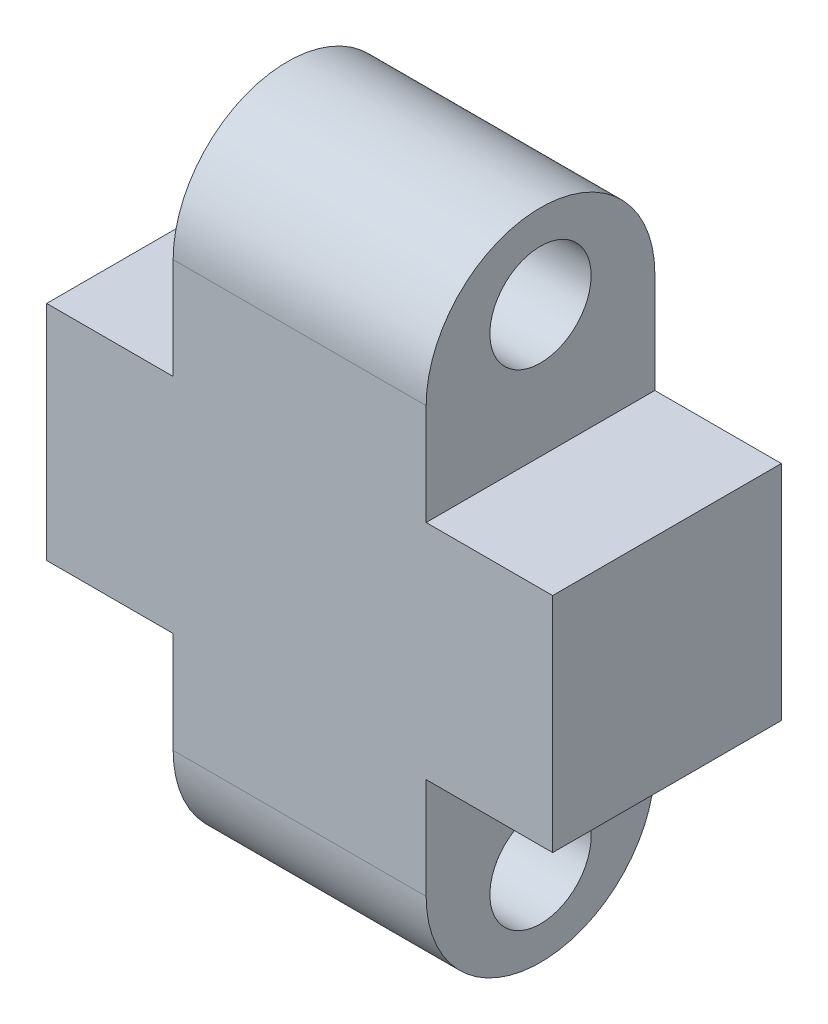
ISO-10303-21;
HEADER;
FILE_DESCRIPTION(('STEP AP214'),'2;1');
FILE_NAME('part.step','',(''),(''),'','','');
FILE_SCHEMA(('AUTOMOTIVE_DESIGN { 1 0 10303 214 1 1 1 1 }'));
ENDSEC;
DATA;
#1=APPLICATION_CONTEXT('core data for automotive mechanical design processes');
#2=APPLICATION_PROTOCOL_DEFINITION('international standard','automotive_design',2000,#1);
#3=PRODUCT_CONTEXT('',#1,'mechanical');
#4=PRODUCT('Part','Part','',(#3));
#5=PRODUCT_RELATED_PRODUCT_CATEGORY('part','',(#4));
#6=PRODUCT_DEFINITION_FORMATION('','',#4);
#7=PRODUCT_DEFINITION_CONTEXT('part definition',#1,'design');
#8=PRODUCT_DEFINITION('design','',#6,#7);
#9=PRODUCT_DEFINITION_SHAPE('','',#8);
#10=(LENGTH_UNIT() NAMED_UNIT(*) SI_UNIT(.MILLI.,.METRE.));
#11=(NAMED_UNIT(*) PLANE_ANGLE_UNIT() SI_UNIT($,.RADIAN.));
#12=(NAMED_UNIT(*) SI_UNIT($,.STERADIAN.) SOLID_ANGLE_UNIT());
#13=UNCERTAINTY_MEASURE_WITH_UNIT(LENGTH_MEASURE(1.E-05),#10,'distance_accuracy_value','');
#14=(GEOMETRIC_REPRESENTATION_CONTEXT(3) GLOBAL_UNCERTAINTY_ASSIGNED_CONTEXT((#13)) GLOBAL_UNIT_ASSIGNED_CONTEXT((#10,
#11,#12)) REPRESENTATION_CONTEXT('',''));
#15=CARTESIAN_POINT('',(0.,0.,0.));
#16=DIRECTION('',(0.,0.,1.));
#17=DIRECTION('',(1.,0.,0.));
#18=AXIS2_PLACEMENT_3D('',#15,#16,#17);
#19=CARTESIAN_POINT('',(-25.,-11.,22.6));
#20=DIRECTION('',(0.,1.,0.));
#21=DIRECTION('',(0.,0.,1.));
#22=AXIS2_PLACEMENT_3D('',#19,#20,#21);
#23=PLANE('',#22);
#24=DIRECTION('',(0.,0.,-1.));
#25=VECTOR('',#24,1.);
#26=CARTESIAN_POINT('',(-12.5,-11.,0.));
#27=LINE('',#26,#25);
#28=CARTESIAN_POINT('',(-12.5,-11.,22.6));
#29=VERTEX_POINT('',#28);
#30=CARTESIAN_POINT('',(-12.5,-11.,0.));
#31=VERTEX_POINT('',#30);
#32=EDGE_CURVE('E211',#29,#31,#27,.T.);
#33=ORIENTED_EDGE('',*,*,#32,.F.);
#34=DIRECTION('',(1.,0.,0.));
#35=VECTOR('',#34,1.);
#36=CARTESIAN_POINT('',(-25.,-11.,22.6));
#37=LINE('',#36,#35);
#38=CARTESIAN_POINT('',(-25.,-11.,22.6));
#39=VERTEX_POINT('',#38);
#40=EDGE_CURVE('E160',#39,#29,#37,.T.);
#41=ORIENTED_EDGE('',*,*,#40,.F.);
#42=DIRECTION('',(0.,0.,-1.));
#43=VECTOR('',#42,1.);
#44=CARTESIAN_POINT('',(-25.,-11.,22.6));
#45=LINE('',#44,#43);
#46=CARTESIAN_POINT('',(-25.,-11.,0.));
#47=VERTEX_POINT('',#46);
#48=EDGE_CURVE('E190',#39,#47,#45,.T.);
#49=ORIENTED_EDGE('',*,*,#48,.T.);
#50=DIRECTION('',(1.,0.,0.));
#51=VECTOR('',#50,1.);
#52=CARTESIAN_POINT('',(-25.,-11.,0.));
#53=LINE('',#52,#51);
#54=EDGE_CURVE('E183',#47,#31,#53,.T.);
#55=ORIENTED_EDGE('',*,*,#54,.T.);
#56=EDGE_LOOP('',(#33,#41,#49,#55));
#57=FACE_BOUND('',#56,.T.);
#58=ADVANCED_FACE('F45',(#57),#23,.F.);
#59=CARTESIAN_POINT('',(-25.,11.,22.6));
#60=DIRECTION('',(0.,-1.,0.));
#61=DIRECTION('',(0.,0.,-1.));
#62=AXIS2_PLACEMENT_3D('',#59,#60,#61);
#63=PLANE('',#62);
#64=DIRECTION('',(0.,0.,-1.));
#65=VECTOR('',#64,1.);
#66=CARTESIAN_POINT('',(12.5,11.,0.));
#67=LINE('',#66,#65);
#68=CARTESIAN_POINT('',(12.5,11.,22.6));
#69=VERTEX_POINT('',#68);
#70=CARTESIAN_POINT('',(12.5,11.,0.));
#71=VERTEX_POINT('',#70);
#72=EDGE_CURVE('E233',#69,#71,#67,.T.);
#73=ORIENTED_EDGE('',*,*,#72,.F.);
#74=DIRECTION('',(-1.,0.,0.));
#75=VECTOR('',#74,1.);
#76=CARTESIAN_POINT('',(-25.,11.,22.6));
#77=LINE('',#76,#75);
#78=CARTESIAN_POINT('',(25.,11.,22.6));
#79=VERTEX_POINT('',#78);
#80=EDGE_CURVE('E166',#79,#69,#77,.T.);
#81=ORIENTED_EDGE('',*,*,#80,.F.);
#82=DIRECTION('',(0.,0.,-1.));
#83=VECTOR('',#82,1.);
#84=CARTESIAN_POINT('',(25.,11.,22.6));
#85=LINE('',#84,#83);
#86=CARTESIAN_POINT('',(25.,11.,0.));
#87=VERTEX_POINT('',#86);
#88=EDGE_CURVE('E11',#79,#87,#85,.T.);
#89=ORIENTED_EDGE('',*,*,#88,.T.);
#90=DIRECTION('',(-1.,0.,0.));
#91=VECTOR('',#90,1.);
#92=CARTESIAN_POINT('',(-25.,11.,0.));
#93=LINE('',#92,#91);
#94=EDGE_CURVE('E176',#87,#71,#93,.T.);
#95=ORIENTED_EDGE('',*,*,#94,.T.);
#96=EDGE_LOOP('',(#73,#81,#89,#95));
#97=FACE_BOUND('',#96,.T.);
#98=ADVANCED_FACE('F323',(#97),#63,.F.);
#99=CARTESIAN_POINT('',(25.,11.,22.6));
#100=DIRECTION('',(-1.,0.,0.));
#101=DIRECTION('',(0.,0.,1.));
#102=AXIS2_PLACEMENT_3D('',#99,#100,#101);
#103=PLANE('',#102);
#104=DIRECTION('',(0.,1.,0.));
#105=VECTOR('',#104,1.);
#106=CARTESIAN_POINT('',(25.,11.,0.));
#107=LINE('',#106,#105);
#108=CARTESIAN_POINT('',(25.,-11.,0.));
#109=VERTEX_POINT('',#108);
#110=EDGE_CURVE('E170',#109,#87,#107,.T.);
#111=ORIENTED_EDGE('',*,*,#110,.T.);
#112=ORIENTED_EDGE('',*,*,#88,.F.);
#113=DIRECTION('',(0.,1.,0.));
#114=VECTOR('',#113,1.);
#115=CARTESIAN_POINT('',(25.,11.,22.6));
#116=LINE('',#115,#114);
#117=CARTESIAN_POINT('',(25.,-11.,22.6));
#118=VERTEX_POINT('',#117);
#119=EDGE_CURVE('E187',#118,#79,#116,.T.);
#120=ORIENTED_EDGE('',*,*,#119,.F.);
#121=DIRECTION('',(0.,0.,-1.));
#122=VECTOR('',#121,1.);
#123=CARTESIAN_POINT('',(25.,-11.,22.6));
#124=LINE('',#123,#122);
#125=EDGE_CURVE('E157',#118,#109,#124,.T.);
#126=ORIENTED_EDGE('',*,*,#125,.T.);
#127=EDGE_LOOP('',(#111,#112,#120,#126));
#128=FACE_BOUND('',#127,.T.);
#129=ADVANCED_FACE('F47',(#128),#103,.F.);
#130=CARTESIAN_POINT('',(-12.5,11.,22.6));
#131=VERTEX_POINT('',#130);
#132=CARTESIAN_POINT('',(-25.,11.,22.6));
#133=VERTEX_POINT('',#132);
#134=EDGE_CURVE('E69',#131,#133,#77,.T.);
#135=ORIENTED_EDGE('',*,*,#134,.F.);
#136=DIRECTION('',(0.,0.,-1.));
#137=VECTOR('',#136,1.);
#138=CARTESIAN_POINT('',(-12.5,11.,0.));
#139=LINE('',#138,#137);
#140=CARTESIAN_POINT('',(-12.5,11.,0.));
#141=VERTEX_POINT('',#140);
#142=EDGE_CURVE('E240',#131,#141,#139,.T.);
#143=ORIENTED_EDGE('',*,*,#142,.T.);
#144=CARTESIAN_POINT('',(-25.,11.,0.));
#145=VERTEX_POINT('',#144);
#146=EDGE_CURVE('E174',#141,#145,#93,.T.);
#147=ORIENTED_EDGE('',*,*,#146,.T.);
#148=DIRECTION('',(0.,0.,-1.));
#149=VECTOR('',#148,1.);
#150=CARTESIAN_POINT('',(-25.,11.,22.6));
#151=LINE('',#150,#149);
#152=EDGE_CURVE('E54',#133,#145,#151,.T.);
#153=ORIENTED_EDGE('',*,*,#152,.F.);
#154=EDGE_LOOP('',(#135,#143,#147,#153));
#155=FACE_BOUND('',#154,.T.);
#156=ADVANCED_FACE('F306',(#155),#63,.F.);
#157=CARTESIAN_POINT('',(-25.,11.,22.6));
#158=DIRECTION('',(1.,0.,0.));
#159=DIRECTION('',(0.,0.,-1.));
#160=AXIS2_PLACEMENT_3D('',#157,#158,#159);
#161=PLANE('',#160);
#162=DIRECTION('',(0.,-1.,0.));
#163=VECTOR('',#162,1.);
#164=CARTESIAN_POINT('',(-25.,11.,0.));
#165=LINE('',#164,#163);
#166=EDGE_CURVE('E179',#145,#47,#165,.T.);
#167=ORIENTED_EDGE('',*,*,#166,.T.);
#168=ORIENTED_EDGE('',*,*,#48,.F.);
#169=DIRECTION('',(0.,-1.,0.));
#170=VECTOR('',#169,1.);
#171=CARTESIAN_POINT('',(-25.,11.,22.6));
#172=LINE('',#171,#170);
#173=EDGE_CURVE('E161',#133,#39,#172,.T.);
#174=ORIENTED_EDGE('',*,*,#173,.F.);
#175=ORIENTED_EDGE('',*,*,#152,.T.);
#176=EDGE_LOOP('',(#167,#168,#174,#175));
#177=FACE_BOUND('',#176,.T.);
#178=ADVANCED_FACE('F198',(#177),#161,.F.);
#179=CARTESIAN_POINT('',(12.5,-11.,22.6));
#180=VERTEX_POINT('',#179);
#181=EDGE_CURVE('E148',#180,#118,#37,.T.);
#182=ORIENTED_EDGE('',*,*,#181,.F.);
#183=DIRECTION('',(0.,0.,-1.));
#184=VECTOR('',#183,1.);
#185=CARTESIAN_POINT('',(12.5,-11.,0.));
#186=LINE('',#185,#184);
#187=CARTESIAN_POINT('',(12.5,-11.,0.));
#188=VERTEX_POINT('',#187);
#189=EDGE_CURVE('E134',#180,#188,#186,.T.);
#190=ORIENTED_EDGE('',*,*,#189,.T.);
#191=EDGE_CURVE('E182',#188,#109,#53,.T.);
#192=ORIENTED_EDGE('',*,*,#191,.T.);
#193=ORIENTED_EDGE('',*,*,#125,.F.);
#194=EDGE_LOOP('',(#182,#190,#192,#193));
#195=FACE_BOUND('',#194,.T.);
#196=ADVANCED_FACE('F155',(#195),#23,.F.);
#197=CARTESIAN_POINT('',(0.,0.,22.6));
#198=DIRECTION('',(0.,0.,1.));
#199=DIRECTION('',(1.,0.,0.));
#200=AXIS2_PLACEMENT_3D('',#197,#198,#199);
#201=PLANE('',#200);
#202=ORIENTED_EDGE('',*,*,#119,.T.);
#203=ORIENTED_EDGE('',*,*,#80,.T.);
#204=DIRECTION('',(0.,-1.,0.));
#205=VECTOR('',#204,1.);
#206=CARTESIAN_POINT('',(12.5,11.,22.6));
#207=LINE('',#206,#205);
#208=CARTESIAN_POINT('',(12.5,21.,22.6));
#209=VERTEX_POINT('',#208);
#210=EDGE_CURVE('E230',#209,#69,#207,.T.);
#211=ORIENTED_EDGE('',*,*,#210,.F.);
#212=DIRECTION('',(-1.,0.,0.));
#213=VECTOR('',#212,1.);
#214=CARTESIAN_POINT('',(12.5,21.,22.6));
#215=LINE('',#214,#213);
#216=CARTESIAN_POINT('',(-12.5,21.,22.6));
#217=VERTEX_POINT('',#216);
#218=EDGE_CURVE('E227',#209,#217,#215,.T.);
#219=ORIENTED_EDGE('',*,*,#218,.T.);
#220=DIRECTION('',(0.,-1.,0.));
#221=VECTOR('',#220,1.);
#222=CARTESIAN_POINT('',(-12.5,11.,22.6));
#223=LINE('',#222,#221);
#224=EDGE_CURVE('E216',#217,#131,#223,.T.);
#225=ORIENTED_EDGE('',*,*,#224,.T.);
#226=ORIENTED_EDGE('',*,*,#134,.T.);
#227=ORIENTED_EDGE('',*,*,#173,.T.);
#228=ORIENTED_EDGE('',*,*,#40,.T.);
#229=DIRECTION('',(0.,1.,0.));
#230=VECTOR('',#229,1.);
#231=CARTESIAN_POINT('',(-12.5,-11.,22.6));
#232=LINE('',#231,#230);
#233=CARTESIAN_POINT('',(-12.5,-21.,22.6));
#234=VERTEX_POINT('',#233);
#235=EDGE_CURVE('E212',#234,#29,#232,.T.);
#236=ORIENTED_EDGE('',*,*,#235,.F.);
#237=DIRECTION('',(-1.,0.,0.));
#238=VECTOR('',#237,1.);
#239=CARTESIAN_POINT('',(12.5,-21.,22.6));
#240=LINE('',#239,#238);
#241=CARTESIAN_POINT('',(12.5,-21.,22.6));
#242=VERTEX_POINT('',#241);
#243=EDGE_CURVE('E151',#242,#234,#240,.T.);
#244=ORIENTED_EDGE('',*,*,#243,.F.);
#245=DIRECTION('',(0.,1.,0.));
#246=VECTOR('',#245,1.);
#247=CARTESIAN_POINT('',(12.5,-11.,22.6));
#248=LINE('',#247,#246);
#249=EDGE_CURVE('E137',#242,#180,#248,.T.);
#250=ORIENTED_EDGE('',*,*,#249,.T.);
#251=ORIENTED_EDGE('',*,*,#181,.T.);
#252=EDGE_LOOP('',(#202,#203,#211,#219,#225,#226,#227,#228,#236,#244,#250,#251));
#253=FACE_BOUND('',#252,.T.);
#254=ADVANCED_FACE('F147',(#253),#201,.T.);
#255=CARTESIAN_POINT('',(0.,0.,0.));
#256=DIRECTION('',(0.,0.,1.));
#257=DIRECTION('',(1.,0.,0.));
#258=AXIS2_PLACEMENT_3D('',#255,#256,#257);
#259=PLANE('',#258);
#260=ORIENTED_EDGE('',*,*,#110,.F.);
#261=ORIENTED_EDGE('',*,*,#191,.F.);
#262=DIRECTION('',(0.,-1.,0.));
#263=VECTOR('',#262,1.);
#264=CARTESIAN_POINT('',(12.5,-21.,0.));
#265=LINE('',#264,#263);
#266=CARTESIAN_POINT('',(12.5,-21.,0.));
#267=VERTEX_POINT('',#266);
#268=EDGE_CURVE('E61',#188,#267,#265,.T.);
#269=ORIENTED_EDGE('',*,*,#268,.T.);
#270=DIRECTION('',(-1.,0.,0.));
#271=VECTOR('',#270,1.);
#272=CARTESIAN_POINT('',(12.5,-21.,0.));
#273=LINE('',#272,#271);
#274=CARTESIAN_POINT('',(-12.5,-21.,0.));
#275=VERTEX_POINT('',#274);
#276=EDGE_CURVE('E265',#267,#275,#273,.T.);
#277=ORIENTED_EDGE('',*,*,#276,.T.);
#278=DIRECTION('',(0.,-1.,0.));
#279=VECTOR('',#278,1.);
#280=CARTESIAN_POINT('',(-12.5,-21.,0.));
#281=LINE('',#280,#279);
#282=EDGE_CURVE('E143',#31,#275,#281,.T.);
#283=ORIENTED_EDGE('',*,*,#282,.F.);
#284=ORIENTED_EDGE('',*,*,#54,.F.);
#285=ORIENTED_EDGE('',*,*,#166,.F.);
#286=ORIENTED_EDGE('',*,*,#146,.F.);
#287=DIRECTION('',(0.,1.,0.));
#288=VECTOR('',#287,1.);
#289=CARTESIAN_POINT('',(-12.5,21.,0.));
#290=LINE('',#289,#288);
#291=CARTESIAN_POINT('',(-12.5,21.,0.));
#292=VERTEX_POINT('',#291);
#293=EDGE_CURVE('E237',#141,#292,#290,.T.);
#294=ORIENTED_EDGE('',*,*,#293,.T.);
#295=DIRECTION('',(-1.,0.,0.));
#296=VECTOR('',#295,1.);
#297=CARTESIAN_POINT('',(12.5,21.,0.));
#298=LINE('',#297,#296);
#299=CARTESIAN_POINT('',(12.5,21.,0.));
#300=VERTEX_POINT('',#299);
#301=EDGE_CURVE('E175',#300,#292,#298,.T.);
#302=ORIENTED_EDGE('',*,*,#301,.F.);
#303=DIRECTION('',(0.,1.,0.));
#304=VECTOR('',#303,1.);
#305=CARTESIAN_POINT('',(12.5,21.,0.));
#306=LINE('',#305,#304);
#307=EDGE_CURVE('E250',#71,#300,#306,.T.);
#308=ORIENTED_EDGE('',*,*,#307,.F.);
#309=ORIENTED_EDGE('',*,*,#94,.F.);
#310=EDGE_LOOP('',(#260,#261,#269,#277,#283,#284,#285,#286,#294,#302,#308,#309));
#311=FACE_BOUND('',#310,.T.);
#312=ADVANCED_FACE('F204',(#311),#259,.F.);
#313=CARTESIAN_POINT('',(12.5,21.,11.3));
#314=DIRECTION('',(-1.,0.,0.));
#315=DIRECTION('',(0.,0.,1.));
#316=AXIS2_PLACEMENT_3D('',#313,#314,#315);
#317=PLANE('',#316);
#318=ORIENTED_EDGE('',*,*,#72,.T.);
#319=ORIENTED_EDGE('',*,*,#307,.T.);
#320=CARTESIAN_POINT('',(12.5,21.,11.3));
#321=DIRECTION('',(1.,0.,0.));
#322=DIRECTION('',(0.,0.,1.));
#323=AXIS2_PLACEMENT_3D('',#320,#321,#322);
#324=CIRCLE('',#323,11.3);
#325=EDGE_CURVE('E247',#300,#209,#324,.T.);
#326=ORIENTED_EDGE('',*,*,#325,.T.);
#327=ORIENTED_EDGE('',*,*,#210,.T.);
#328=EDGE_LOOP('',(#318,#319,#326,#327));
#329=FACE_BOUND('',#328,.T.);
#330=CARTESIAN_POINT('',(12.5,24.,11.3));
#331=DIRECTION('',(1.,0.,0.));
#332=DIRECTION('',(0.,0.,-1.));
#333=AXIS2_PLACEMENT_3D('',#330,#331,#332);
#334=CIRCLE('',#333,5.);
#335=CARTESIAN_POINT('',(12.5,24.,6.3));
#336=VERTEX_POINT('',#335);
#337=EDGE_CURVE('E243',#336,#336,#334,.T.);
#338=ORIENTED_EDGE('',*,*,#337,.F.);
#339=EDGE_LOOP('',(#338));
#340=FACE_BOUND('',#339,.T.);
#341=ADVANCED_FACE('F319',(#329,#340),#317,.F.);
#342=CARTESIAN_POINT('',(-12.5,21.,11.3));
#343=DIRECTION('',(-1.,0.,0.));
#344=DIRECTION('',(0.,0.,1.));
#345=AXIS2_PLACEMENT_3D('',#342,#343,#344);
#346=PLANE('',#345);
#347=ORIENTED_EDGE('',*,*,#142,.F.);
#348=ORIENTED_EDGE('',*,*,#224,.F.);
#349=CARTESIAN_POINT('',(-12.5,21.,11.3));
#350=DIRECTION('',(1.,0.,0.));
#351=DIRECTION('',(0.,0.,1.));
#352=AXIS2_PLACEMENT_3D('',#349,#350,#351);
#353=CIRCLE('',#352,11.3);
#354=EDGE_CURVE('E234',#292,#217,#353,.T.);
#355=ORIENTED_EDGE('',*,*,#354,.F.);
#356=ORIENTED_EDGE('',*,*,#293,.F.);
#357=EDGE_LOOP('',(#347,#348,#355,#356));
#358=FACE_BOUND('',#357,.T.);
#359=CARTESIAN_POINT('',(-12.5,24.,11.3));
#360=DIRECTION('',(1.,0.,0.));
#361=DIRECTION('',(0.,0.,-1.));
#362=AXIS2_PLACEMENT_3D('',#359,#360,#361);
#363=CIRCLE('',#362,5.);
#364=CARTESIAN_POINT('',(-12.5,24.,6.3));
#365=VERTEX_POINT('',#364);
#366=EDGE_CURVE('E256',#365,#365,#363,.T.);
#367=ORIENTED_EDGE('',*,*,#366,.T.);
#368=EDGE_LOOP('',(#367));
#369=FACE_BOUND('',#368,.T.);
#370=ADVANCED_FACE('F308',(#358,#369),#346,.T.);
#371=CARTESIAN_POINT('',(12.5,21.,11.3));
#372=DIRECTION('',(-1.,0.,0.));
#373=DIRECTION('',(0.,0.,1.));
#374=AXIS2_PLACEMENT_3D('',#371,#372,#373);
#375=CYLINDRICAL_SURFACE('',#374,11.3);
#376=ORIENTED_EDGE('',*,*,#354,.T.);
#377=ORIENTED_EDGE('',*,*,#218,.F.);
#378=ORIENTED_EDGE('',*,*,#325,.F.);
#379=ORIENTED_EDGE('',*,*,#301,.T.);
#380=EDGE_LOOP('',(#376,#377,#378,#379));
#381=FACE_BOUND('',#380,.T.);
#382=ADVANCED_FACE('F315',(#381),#375,.T.);
#383=CARTESIAN_POINT('',(12.5,24.,11.3));
#384=DIRECTION('',(-1.,0.,0.));
#385=DIRECTION('',(0.,0.,1.));
#386=AXIS2_PLACEMENT_3D('',#383,#384,#385);
#387=CYLINDRICAL_SURFACE('',#386,5.);
#388=ORIENTED_EDGE('',*,*,#337,.T.);
#389=EDGE_LOOP('',(#388));
#390=FACE_BOUND('',#389,.T.);
#391=ORIENTED_EDGE('',*,*,#366,.F.);
#392=EDGE_LOOP('',(#391));
#393=FACE_BOUND('',#392,.T.);
#394=ADVANCED_FACE('F376',(#390,#393),#387,.F.);
#395=CARTESIAN_POINT('',(12.5,-21.,11.3));
#396=DIRECTION('',(-1.,0.,0.));
#397=DIRECTION('',(0.,0.,1.));
#398=AXIS2_PLACEMENT_3D('',#395,#396,#397);
#399=CYLINDRICAL_SURFACE('',#398,11.3);
#400=CARTESIAN_POINT('',(-12.5,-21.,11.3));
#401=DIRECTION('',(-1.,0.,0.));
#402=DIRECTION('',(0.,0.,1.));
#403=AXIS2_PLACEMENT_3D('',#400,#401,#402);
#404=CIRCLE('',#403,11.3);
#405=EDGE_CURVE('E270',#275,#234,#404,.T.);
#406=ORIENTED_EDGE('',*,*,#405,.F.);
#407=ORIENTED_EDGE('',*,*,#276,.F.);
#408=CARTESIAN_POINT('',(12.5,-21.,11.3));
#409=DIRECTION('',(-1.,0.,0.));
#410=DIRECTION('',(0.,0.,1.));
#411=AXIS2_PLACEMENT_3D('',#408,#409,#410);
#412=CIRCLE('',#411,11.3);
#413=EDGE_CURVE('E153',#267,#242,#412,.T.);
#414=ORIENTED_EDGE('',*,*,#413,.T.);
#415=ORIENTED_EDGE('',*,*,#243,.T.);
#416=EDGE_LOOP('',(#406,#407,#414,#415));
#417=FACE_BOUND('',#416,.T.);
#418=ADVANCED_FACE('F303',(#417),#399,.T.);
#419=CARTESIAN_POINT('',(12.5,-21.,11.3));
#420=DIRECTION('',(-1.,0.,0.));
#421=DIRECTION('',(0.,0.,1.));
#422=AXIS2_PLACEMENT_3D('',#419,#420,#421);
#423=PLANE('',#422);
#424=CARTESIAN_POINT('',(12.5,-24.,11.3));
#425=DIRECTION('',(-1.,0.,0.));
#426=DIRECTION('',(0.,0.,-1.));
#427=AXIS2_PLACEMENT_3D('',#424,#425,#426);
#428=CIRCLE('',#427,5.);
#429=CARTESIAN_POINT('',(12.5,-24.,6.3));
#430=VERTEX_POINT('',#429);
#431=EDGE_CURVE('E277',#430,#430,#428,.T.);
#432=ORIENTED_EDGE('',*,*,#431,.T.);
#433=EDGE_LOOP('',(#432));
#434=FACE_BOUND('',#433,.T.);
#435=ORIENTED_EDGE('',*,*,#189,.F.);
#436=ORIENTED_EDGE('',*,*,#249,.F.);
#437=ORIENTED_EDGE('',*,*,#413,.F.);
#438=ORIENTED_EDGE('',*,*,#268,.F.);
#439=EDGE_LOOP('',(#435,#436,#437,#438));
#440=FACE_BOUND('',#439,.T.);
#441=ADVANCED_FACE('F136',(#434,#440),#423,.F.);
#442=CARTESIAN_POINT('',(-12.5,-21.,11.3));
#443=DIRECTION('',(-1.,0.,0.));
#444=DIRECTION('',(0.,0.,1.));
#445=AXIS2_PLACEMENT_3D('',#442,#443,#444);
#446=PLANE('',#445);
#447=CARTESIAN_POINT('',(-12.5,-24.,11.3));
#448=DIRECTION('',(-1.,0.,0.));
#449=DIRECTION('',(0.,0.,-1.));
#450=AXIS2_PLACEMENT_3D('',#447,#448,#449);
#451=CIRCLE('',#450,5.);
#452=CARTESIAN_POINT('',(-12.5,-24.,6.3));
#453=VERTEX_POINT('',#452);
#454=EDGE_CURVE('E282',#453,#453,#451,.T.);
#455=ORIENTED_EDGE('',*,*,#454,.F.);
#456=EDGE_LOOP('',(#455));
#457=FACE_BOUND('',#456,.T.);
#458=ORIENTED_EDGE('',*,*,#32,.T.);
#459=ORIENTED_EDGE('',*,*,#282,.T.);
#460=ORIENTED_EDGE('',*,*,#405,.T.);
#461=ORIENTED_EDGE('',*,*,#235,.T.);
#462=EDGE_LOOP('',(#458,#459,#460,#461));
#463=FACE_BOUND('',#462,.T.);
#464=ADVANCED_FACE('F294',(#457,#463),#446,.T.);
#465=CARTESIAN_POINT('',(12.5,-24.,11.3));
#466=DIRECTION('',(-1.,0.,0.));
#467=DIRECTION('',(0.,0.,1.));
#468=AXIS2_PLACEMENT_3D('',#465,#466,#467);
#469=CYLINDRICAL_SURFACE('',#468,5.);
#470=ORIENTED_EDGE('',*,*,#431,.F.);
#471=EDGE_LOOP('',(#470));
#472=FACE_BOUND('',#471,.T.);
#473=ORIENTED_EDGE('',*,*,#454,.T.);
#474=EDGE_LOOP('',(#473));
#475=FACE_BOUND('',#474,.T.);
#476=ADVANCED_FACE('F291',(#472,#475),#469,.F.);
#477=CLOSED_SHELL('',(#58,#98,#129,#156,#178,#196,#254,#312,#341,#370,#382,#394,#418,#441,#464,#476));
#478=MANIFOLD_SOLID_BREP('B2',#477);
#479=ADVANCED_BREP_SHAPE_REPRESENTATION('',(#18,#478),#14);
#480=SHAPE_DEFINITION_REPRESENTATION(#9,#479);
ENDSEC;
END-ISO-10303-21;
